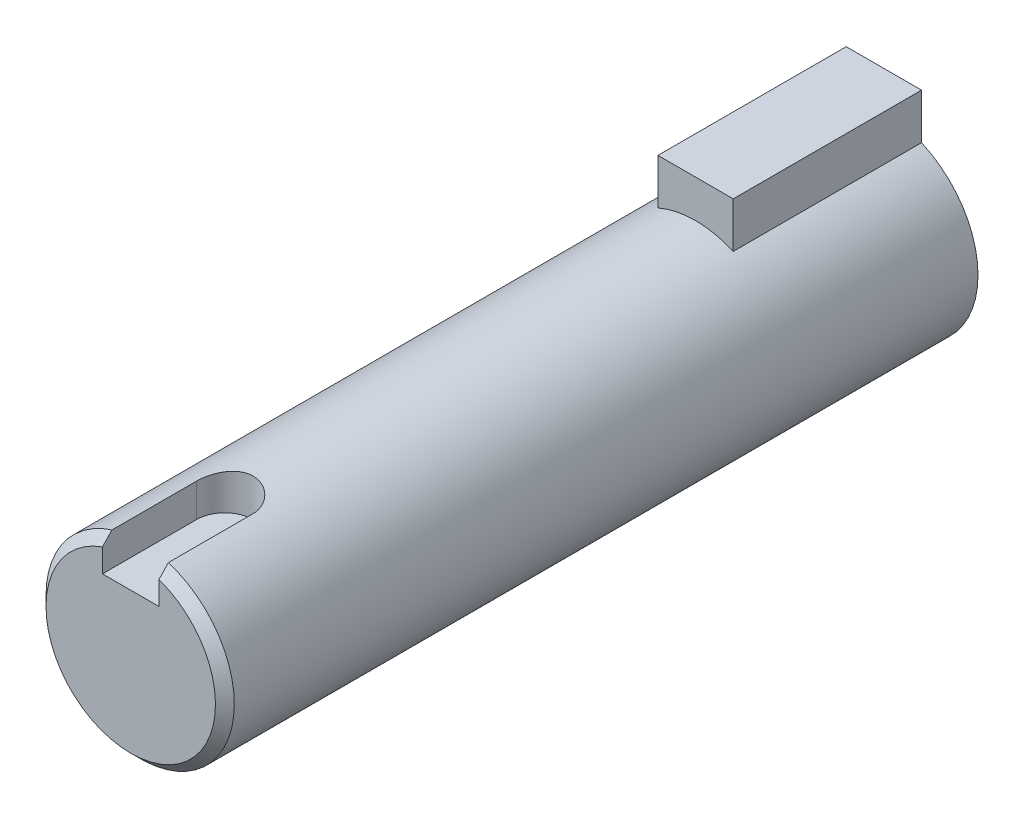
ISO-10303-21;
HEADER;
FILE_DESCRIPTION(('STEP AP214'),'2;1');
FILE_NAME('part.step','',(''),(''),'','','');
FILE_SCHEMA(('AUTOMOTIVE_DESIGN { 1 0 10303 214 1 1 1 1 }'));
ENDSEC;
DATA;
#1=APPLICATION_CONTEXT('core data for automotive mechanical design processes');
#2=APPLICATION_PROTOCOL_DEFINITION('international standard','automotive_design',2000,#1);
#3=PRODUCT_CONTEXT('',#1,'mechanical');
#4=PRODUCT('Part','Part','',(#3));
#5=PRODUCT_RELATED_PRODUCT_CATEGORY('part','',(#4));
#6=PRODUCT_DEFINITION_FORMATION('','',#4);
#7=PRODUCT_DEFINITION_CONTEXT('part definition',#1,'design');
#8=PRODUCT_DEFINITION('design','',#6,#7);
#9=PRODUCT_DEFINITION_SHAPE('','',#8);
#10=(LENGTH_UNIT() NAMED_UNIT(*) SI_UNIT(.MILLI.,.METRE.));
#11=(NAMED_UNIT(*) PLANE_ANGLE_UNIT() SI_UNIT($,.RADIAN.));
#12=(NAMED_UNIT(*) SI_UNIT($,.STERADIAN.) SOLID_ANGLE_UNIT());
#13=UNCERTAINTY_MEASURE_WITH_UNIT(LENGTH_MEASURE(1.E-05),#10,'distance_accuracy_value','');
#14=(GEOMETRIC_REPRESENTATION_CONTEXT(3) GLOBAL_UNCERTAINTY_ASSIGNED_CONTEXT((#13)) GLOBAL_UNIT_ASSIGNED_CONTEXT((#10,
#11,#12)) REPRESENTATION_CONTEXT('',''));
#15=CARTESIAN_POINT('',(0.,0.,0.));
#16=DIRECTION('',(0.,0.,1.));
#17=DIRECTION('',(1.,0.,0.));
#18=AXIS2_PLACEMENT_3D('',#15,#16,#17);
#19=CARTESIAN_POINT('',(0.,0.,10.));
#20=DIRECTION('',(0.,0.,-1.));
#21=DIRECTION('',(-1.,0.,0.));
#22=AXIS2_PLACEMENT_3D('',#19,#20,#21);
#23=CYLINDRICAL_SURFACE('',#22,5.);
#24=CARTESIAN_POINT('',(0.,0.,0.));
#25=DIRECTION('',(0.,0.,1.));
#26=DIRECTION('',(1.,0.,0.));
#27=AXIS2_PLACEMENT_3D('',#24,#25,#26);
#28=CIRCLE('',#27,5.);
#29=CARTESIAN_POINT('',(-2.,4.58257569495584,0.));
#30=VERTEX_POINT('',#29);
#31=CARTESIAN_POINT('',(2.,4.58257569495584,0.));
#32=VERTEX_POINT('',#31);
#33=EDGE_CURVE('E173',#30,#32,#28,.T.);
#34=ORIENTED_EDGE('',*,*,#33,.T.);
#35=DIRECTION('',(0.,0.,-1.));
#36=VECTOR('',#35,1.);
#37=CARTESIAN_POINT('',(2.,4.58257569495584,10.));
#38=LINE('',#37,#36);
#39=CARTESIAN_POINT('',(2.,4.58257569495584,10.));
#40=VERTEX_POINT('',#39);
#41=EDGE_CURVE('E150',#40,#32,#38,.T.);
#42=ORIENTED_EDGE('',*,*,#41,.F.);
#43=CARTESIAN_POINT('',(0.,0.,10.));
#44=DIRECTION('',(0.,0.,1.));
#45=DIRECTION('',(1.,0.,0.));
#46=AXIS2_PLACEMENT_3D('',#43,#44,#45);
#47=CIRCLE('',#46,5.);
#48=CARTESIAN_POINT('',(-2.,4.58257569495584,10.));
#49=VERTEX_POINT('',#48);
#50=EDGE_CURVE('E172',#40,#49,#47,.T.);
#51=ORIENTED_EDGE('',*,*,#50,.T.);
#52=DIRECTION('',(0.,0.,-1.));
#53=VECTOR('',#52,1.);
#54=CARTESIAN_POINT('',(-2.,4.58257569495584,10.));
#55=LINE('',#54,#53);
#56=EDGE_CURVE('E187',#49,#30,#55,.T.);
#57=ORIENTED_EDGE('',*,*,#56,.T.);
#58=EDGE_LOOP('',(#34,#42,#51,#57));
#59=FACE_BOUND('',#58,.T.);
#60=DIRECTION('',(0.,0.,-1.));
#61=VECTOR('',#60,1.);
#62=CARTESIAN_POINT('',(1.5,4.76969600708473,10.));
#63=LINE('',#62,#61);
#64=CARTESIAN_POINT('',(1.5,4.76969600708473,39.5));
#65=VERTEX_POINT('',#64);
#66=CARTESIAN_POINT('',(1.5,4.76969600708473,35.));
#67=VERTEX_POINT('',#66);
#68=EDGE_CURVE('E169',#65,#67,#63,.T.);
#69=ORIENTED_EDGE('',*,*,#68,.F.);
#70=CARTESIAN_POINT('',(0.,0.,39.5));
#71=DIRECTION('',(0.,0.,1.));
#72=DIRECTION('',(1.,0.,0.));
#73=AXIS2_PLACEMENT_3D('',#70,#71,#72);
#74=CIRCLE('',#73,5.);
#75=CARTESIAN_POINT('',(-1.5,4.76969600708473,39.5));
#76=VERTEX_POINT('',#75);
#77=EDGE_CURVE('E64',#65,#76,#74,.F.);
#78=ORIENTED_EDGE('',*,*,#77,.T.);
#79=DIRECTION('',(0.,0.,-1.));
#80=VECTOR('',#79,1.);
#81=CARTESIAN_POINT('',(-1.5,4.76969600708473,10.));
#82=LINE('',#81,#80);
#83=CARTESIAN_POINT('',(-1.5,4.76969600708473,35.));
#84=VERTEX_POINT('',#83);
#85=EDGE_CURVE('E164',#84,#76,#82,.F.);
#86=ORIENTED_EDGE('',*,*,#85,.F.);
#87=CARTESIAN_POINT('',(1.5,4.76969600708473,35.));
#88=CARTESIAN_POINT('',(1.50000085357071,4.76969249084934,34.958820607092));
#89=CARTESIAN_POINT('',(1.49830317083428,4.77022997000129,34.9176619568739));
#90=CARTESIAN_POINT('',(1.49153785660317,4.77235095109999,34.8356588379044));
#91=CARTESIAN_POINT('',(1.48647098275841,4.77393421787376,34.7948143006051));
#92=CARTESIAN_POINT('',(1.46630203689311,4.78018490618873,34.6734094590453));
#93=CARTESIAN_POINT('',(1.44623120413662,4.78635370384275,34.5936936095836));
#94=CARTESIAN_POINT('',(1.39353102315626,4.80195952113208,34.4389644216141));
#95=CARTESIAN_POINT('',(1.36090607068203,4.81139539670393,34.3639494478019));
#96=CARTESIAN_POINT('',(1.28407841117656,4.83246571212052,34.2204033184024));
#97=CARTESIAN_POINT('',(1.23987031651226,4.84410117434933,34.1518752002716));
#98=CARTESIAN_POINT('',(1.13964850658326,4.86866835244721,34.021133944003));
#99=CARTESIAN_POINT('',(1.08333433465208,4.88162755412974,33.9591563396566));
#100=CARTESIAN_POINT('',(0.961138919873353,4.90714811559049,33.8453644161));
#101=CARTESIAN_POINT('',(0.895256063916347,4.91970940785249,33.7935518139969));
#102=CARTESIAN_POINT('',(0.754109921315428,4.94333239727705,33.7005362296815));
#103=CARTESIAN_POINT('',(0.678680819336257,4.95435770971354,33.659574819702));
#104=CARTESIAN_POINT('',(0.521621185505773,4.97334469846208,33.5910115883818));
#105=CARTESIAN_POINT('',(0.439992259012927,4.98130716463903,33.5634063222057));
#106=CARTESIAN_POINT('',(0.275324697874878,4.99307639935002,33.523120200898));
#107=CARTESIAN_POINT('',(0.192393125294253,4.99699549276993,33.5100351420303));
#108=CARTESIAN_POINT('',(0.0254235719980806,5.00063202022426,33.4978826586367));
#109=CARTESIAN_POINT('',(-0.0586141962423639,5.00035024971471,33.4988125802998));
#110=CARTESIAN_POINT('',(-0.222571599946019,4.99569602566267,33.514392908759));
#111=CARTESIAN_POINT('',(-0.302537145464643,4.99145415509187,33.5286053449787));
#112=CARTESIAN_POINT('',(-0.458890052102027,4.9795151369998,33.5696316352381));
#113=CARTESIAN_POINT('',(-0.535277225531999,4.97181780846028,33.5964461494559));
#114=CARTESIAN_POINT('',(-0.683347815892217,4.95365214926145,33.6622122216464));
#115=CARTESIAN_POINT('',(-0.754966006044144,4.94315255692525,33.7013016443569));
#116=CARTESIAN_POINT('',(-0.890765529574422,4.92049624651755,33.7903985900483));
#117=CARTESIAN_POINT('',(-0.954945191614596,4.90833915735884,33.8404085594788));
#118=CARTESIAN_POINT('',(-1.07665450541275,4.88311673571409,33.9521919880835));
#119=CARTESIAN_POINT('',(-1.13383351478034,4.87003445449554,34.0143438637607));
#120=CARTESIAN_POINT('',(-1.23706769492487,4.84484215114658,34.1474974234279));
#121=CARTESIAN_POINT('',(-1.28311962013078,4.83273241337565,34.2185016803655));
#122=CARTESIAN_POINT('',(-1.36316407240863,4.81077228795653,34.3682809284493));
#123=CARTESIAN_POINT('',(-1.39703006341135,4.80094596245948,34.4471271795934));
#124=CARTESIAN_POINT('',(-1.45085886004699,4.78495663653201,34.6097245039817));
#125=CARTESIAN_POINT('',(-1.47084293218036,4.77878803475875,34.6934678607144));
#126=CARTESIAN_POINT('',(-1.4890120359008,4.77314032325006,34.8149948890702));
#127=CARTESIAN_POINT('',(-1.49313202989009,4.77185156275267,34.8518907341796));
#128=CARTESIAN_POINT('',(-1.49862355614854,4.77012928611782,34.9258514790995));
#129=CARTESIAN_POINT('',(-1.49999912968269,4.76969451246644,34.9629160496639));
#130=CARTESIAN_POINT('',(-1.5,4.76969600708473,35.));
#131=B_SPLINE_CURVE_WITH_KNOTS('',3,(#87,#88,#89,#90,#91,#92,#93,#94,#95,#96,#97,#98,#99,#100,
#101,#102,#103,#104,#105,#106,#107,#108,#109,#110,#111,#112,#113,#114,#115,#116,#117,#118,#119,
#120,#121,#122,#123,#124,#125,#126,#127,#128,#129,#130),.UNSPECIFIED.,.F.,.F.,(4,2,2,2,2,2,2,2,
2,2,2,2,2,2,2,2,2,2,2,2,2,4),(0.,0.123459071219744,0.246890388853047,0.492911349615212,
0.738846245884322,0.984895736828089,1.23795510798803,1.49105719006936,1.74939356197455,
2.00766326783256,2.25854751319802,2.50938425289471,2.75223130012967,2.99509107067836,
3.24078242562731,3.48652887757005,3.74172568310981,3.99699683536778,4.25484698071527,
4.51230123440207,4.62365084745809,4.73483637253615),.UNSPECIFIED.);
#132=EDGE_CURVE('E131',#67,#84,#131,.T.);
#133=ORIENTED_EDGE('',*,*,#132,.F.);
#134=EDGE_LOOP('',(#69,#78,#86,#133));
#135=FACE_BOUND('',#134,.T.);
#136=ADVANCED_FACE('F50',(#59,#135),#23,.T.);
#137=CARTESIAN_POINT('',(0.,0.,40.));
#138=DIRECTION('',(0.,0.,1.));
#139=DIRECTION('',(1.,0.,0.));
#140=AXIS2_PLACEMENT_3D('',#137,#138,#139);
#141=PLANE('',#140);
#142=DIRECTION('',(0.,1.,0.));
#143=VECTOR('',#142,1.);
#144=CARTESIAN_POINT('',(-1.5,0.,40.));
#145=LINE('',#144,#143);
#146=CARTESIAN_POINT('',(-1.5,3.,40.));
#147=VERTEX_POINT('',#146);
#148=CARTESIAN_POINT('',(-1.5,4.24264068711929,40.));
#149=VERTEX_POINT('',#148);
#150=EDGE_CURVE('E133',#147,#149,#145,.T.);
#151=ORIENTED_EDGE('',*,*,#150,.T.);
#152=CARTESIAN_POINT('',(0.,0.,40.));
#153=DIRECTION('',(0.,0.,1.));
#154=DIRECTION('',(1.,0.,0.));
#155=AXIS2_PLACEMENT_3D('',#152,#153,#154);
#156=CIRCLE('',#155,4.5);
#157=CARTESIAN_POINT('',(1.5,4.24264068711929,40.));
#158=VERTEX_POINT('',#157);
#159=EDGE_CURVE('E132',#149,#158,#156,.T.);
#160=ORIENTED_EDGE('',*,*,#159,.T.);
#161=DIRECTION('',(0.,-1.,0.));
#162=VECTOR('',#161,1.);
#163=CARTESIAN_POINT('',(1.5,0.,40.));
#164=LINE('',#163,#162);
#165=CARTESIAN_POINT('',(1.5,3.,40.));
#166=VERTEX_POINT('',#165);
#167=EDGE_CURVE('E124',#158,#166,#164,.T.);
#168=ORIENTED_EDGE('',*,*,#167,.T.);
#169=DIRECTION('',(-1.,0.,0.));
#170=VECTOR('',#169,1.);
#171=CARTESIAN_POINT('',(0.,3.,40.));
#172=LINE('',#171,#170);
#173=EDGE_CURVE('E129',#166,#147,#172,.T.);
#174=ORIENTED_EDGE('',*,*,#173,.T.);
#175=EDGE_LOOP('',(#151,#160,#168,#174));
#176=FACE_BOUND('',#175,.T.);
#177=ADVANCED_FACE('F126',(#176),#141,.T.);
#178=CARTESIAN_POINT('',(2.,7.,10.));
#179=DIRECTION('',(-1.,0.,0.));
#180=DIRECTION('',(0.,0.,1.));
#181=AXIS2_PLACEMENT_3D('',#178,#179,#180);
#182=PLANE('',#181);
#183=DIRECTION('',(0.,1.,0.));
#184=VECTOR('',#183,1.);
#185=CARTESIAN_POINT('',(2.,7.,0.));
#186=LINE('',#185,#184);
#187=CARTESIAN_POINT('',(2.,7.,0.));
#188=VERTEX_POINT('',#187);
#189=EDGE_CURVE('E188',#32,#188,#186,.T.);
#190=ORIENTED_EDGE('',*,*,#189,.T.);
#191=DIRECTION('',(0.,0.,-1.));
#192=VECTOR('',#191,1.);
#193=CARTESIAN_POINT('',(2.,7.,10.));
#194=LINE('',#193,#192);
#195=CARTESIAN_POINT('',(2.,7.,10.));
#196=VERTEX_POINT('',#195);
#197=EDGE_CURVE('E202',#196,#188,#194,.T.);
#198=ORIENTED_EDGE('',*,*,#197,.F.);
#199=DIRECTION('',(0.,1.,0.));
#200=VECTOR('',#199,1.);
#201=CARTESIAN_POINT('',(2.,7.,10.));
#202=LINE('',#201,#200);
#203=EDGE_CURVE('E176',#40,#196,#202,.T.);
#204=ORIENTED_EDGE('',*,*,#203,.F.);
#205=ORIENTED_EDGE('',*,*,#41,.T.);
#206=EDGE_LOOP('',(#190,#198,#204,#205));
#207=FACE_BOUND('',#206,.T.);
#208=ADVANCED_FACE('F243',(#207),#182,.F.);
#209=CARTESIAN_POINT('',(-2.,7.,10.));
#210=DIRECTION('',(0.,-1.,0.));
#211=DIRECTION('',(0.,0.,-1.));
#212=AXIS2_PLACEMENT_3D('',#209,#210,#211);
#213=PLANE('',#212);
#214=DIRECTION('',(-1.,0.,0.));
#215=VECTOR('',#214,1.);
#216=CARTESIAN_POINT('',(-2.,7.,0.));
#217=LINE('',#216,#215);
#218=CARTESIAN_POINT('',(-2.,7.,0.));
#219=VERTEX_POINT('',#218);
#220=EDGE_CURVE('E192',#188,#219,#217,.T.);
#221=ORIENTED_EDGE('',*,*,#220,.T.);
#222=DIRECTION('',(0.,0.,-1.));
#223=VECTOR('',#222,1.);
#224=CARTESIAN_POINT('',(-2.,7.,10.));
#225=LINE('',#224,#223);
#226=CARTESIAN_POINT('',(-2.,7.,10.));
#227=VERTEX_POINT('',#226);
#228=EDGE_CURVE('E203',#227,#219,#225,.T.);
#229=ORIENTED_EDGE('',*,*,#228,.F.);
#230=DIRECTION('',(-1.,0.,0.));
#231=VECTOR('',#230,1.);
#232=CARTESIAN_POINT('',(-2.,7.,10.));
#233=LINE('',#232,#231);
#234=EDGE_CURVE('E178',#196,#227,#233,.T.);
#235=ORIENTED_EDGE('',*,*,#234,.F.);
#236=ORIENTED_EDGE('',*,*,#197,.T.);
#237=EDGE_LOOP('',(#221,#229,#235,#236));
#238=FACE_BOUND('',#237,.T.);
#239=ADVANCED_FACE('F258',(#238),#213,.F.);
#240=CARTESIAN_POINT('',(-2.,7.,10.));
#241=DIRECTION('',(1.,0.,0.));
#242=DIRECTION('',(0.,0.,-1.));
#243=AXIS2_PLACEMENT_3D('',#240,#241,#242);
#244=PLANE('',#243);
#245=DIRECTION('',(0.,-1.,0.));
#246=VECTOR('',#245,1.);
#247=CARTESIAN_POINT('',(-2.,7.,0.));
#248=LINE('',#247,#246);
#249=EDGE_CURVE('E179',#219,#30,#248,.T.);
#250=ORIENTED_EDGE('',*,*,#249,.T.);
#251=ORIENTED_EDGE('',*,*,#56,.F.);
#252=DIRECTION('',(0.,-1.,0.));
#253=VECTOR('',#252,1.);
#254=CARTESIAN_POINT('',(-2.,7.,10.));
#255=LINE('',#254,#253);
#256=EDGE_CURVE('E181',#227,#49,#255,.T.);
#257=ORIENTED_EDGE('',*,*,#256,.F.);
#258=ORIENTED_EDGE('',*,*,#228,.T.);
#259=EDGE_LOOP('',(#250,#251,#257,#258));
#260=FACE_BOUND('',#259,.T.);
#261=ADVANCED_FACE('F248',(#260),#244,.F.);
#262=CARTESIAN_POINT('',(0.,0.,10.));
#263=DIRECTION('',(0.,0.,1.));
#264=DIRECTION('',(1.,0.,0.));
#265=AXIS2_PLACEMENT_3D('',#262,#263,#264);
#266=PLANE('',#265);
#267=ORIENTED_EDGE('',*,*,#50,.F.);
#268=ORIENTED_EDGE('',*,*,#203,.T.);
#269=ORIENTED_EDGE('',*,*,#234,.T.);
#270=ORIENTED_EDGE('',*,*,#256,.T.);
#271=EDGE_LOOP('',(#267,#268,#269,#270));
#272=FACE_BOUND('',#271,.T.);
#273=ADVANCED_FACE('F246',(#272),#266,.T.);
#274=CARTESIAN_POINT('',(0.,0.,0.));
#275=DIRECTION('',(0.,0.,1.));
#276=DIRECTION('',(1.,0.,0.));
#277=AXIS2_PLACEMENT_3D('',#274,#275,#276);
#278=PLANE('',#277);
#279=ORIENTED_EDGE('',*,*,#33,.F.);
#280=ORIENTED_EDGE('',*,*,#249,.F.);
#281=ORIENTED_EDGE('',*,*,#220,.F.);
#282=ORIENTED_EDGE('',*,*,#189,.F.);
#283=EDGE_LOOP('',(#279,#280,#281,#282));
#284=FACE_BOUND('',#283,.T.);
#285=ADVANCED_FACE('F229',(#284),#278,.F.);
#286=CARTESIAN_POINT('',(0.,7.,35.));
#287=DIRECTION('',(0.,-1.,0.));
#288=DIRECTION('',(0.,0.,-1.));
#289=AXIS2_PLACEMENT_3D('',#286,#287,#288);
#290=CYLINDRICAL_SURFACE('',#289,1.5);
#291=ORIENTED_EDGE('',*,*,#132,.T.);
#292=DIRECTION('',(0.,-1.,0.));
#293=VECTOR('',#292,1.);
#294=CARTESIAN_POINT('',(-1.5,7.,35.));
#295=LINE('',#294,#293);
#296=CARTESIAN_POINT('',(-1.5,3.,35.));
#297=VERTEX_POINT('',#296);
#298=EDGE_CURVE('E159',#84,#297,#295,.T.);
#299=ORIENTED_EDGE('',*,*,#298,.T.);
#300=CARTESIAN_POINT('',(0.,3.,35.));
#301=DIRECTION('',(0.,1.,0.));
#302=DIRECTION('',(0.,0.,1.));
#303=AXIS2_PLACEMENT_3D('',#300,#301,#302);
#304=CIRCLE('',#303,1.5);
#305=CARTESIAN_POINT('',(1.5,3.,35.));
#306=VERTEX_POINT('',#305);
#307=EDGE_CURVE('E153',#306,#297,#304,.T.);
#308=ORIENTED_EDGE('',*,*,#307,.F.);
#309=DIRECTION('',(0.,-1.,0.));
#310=VECTOR('',#309,1.);
#311=CARTESIAN_POINT('',(1.5,7.,35.));
#312=LINE('',#311,#310);
#313=EDGE_CURVE('E151',#67,#306,#312,.T.);
#314=ORIENTED_EDGE('',*,*,#313,.F.);
#315=EDGE_LOOP('',(#291,#299,#308,#314));
#316=FACE_BOUND('',#315,.T.);
#317=ADVANCED_FACE('F221',(#316),#290,.F.);
#318=CARTESIAN_POINT('',(1.5,7.,40.));
#319=DIRECTION('',(-1.,0.,0.));
#320=DIRECTION('',(0.,0.,1.));
#321=AXIS2_PLACEMENT_3D('',#318,#319,#320);
#322=PLANE('',#321);
#323=ORIENTED_EDGE('',*,*,#167,.F.);
#324=CARTESIAN_POINT('',(1.5,4.24264068711929,40.));
#325=CARTESIAN_POINT('',(1.5,4.33072666160121,39.9169232397423));
#326=CARTESIAN_POINT('',(1.5,4.41869093042371,39.8337181882542));
#327=CARTESIAN_POINT('',(1.5,4.59437603702419,39.6670515215299));
#328=CARTESIAN_POINT('',(1.5,4.68209687485685,39.5835899063514));
#329=CARTESIAN_POINT('',(1.5,4.76969600708473,39.5));
#330=B_SPLINE_CURVE_WITH_KNOTS('',3,(#324,#325,#326,#327,#328,#329),.UNSPECIFIED.,.F.,.F.,(4,2,
4),(0.,0.363245287159553,0.726490492749918),.UNSPECIFIED.);
#331=EDGE_CURVE('E80',#158,#65,#330,.T.);
#332=ORIENTED_EDGE('',*,*,#331,.T.);
#333=ORIENTED_EDGE('',*,*,#68,.T.);
#334=ORIENTED_EDGE('',*,*,#313,.T.);
#335=DIRECTION('',(0.,0.,-1.));
#336=VECTOR('',#335,1.);
#337=CARTESIAN_POINT('',(1.5,3.,40.));
#338=LINE('',#337,#336);
#339=EDGE_CURVE('E143',#166,#306,#338,.T.);
#340=ORIENTED_EDGE('',*,*,#339,.F.);
#341=EDGE_LOOP('',(#323,#332,#333,#334,#340));
#342=FACE_BOUND('',#341,.T.);
#343=ADVANCED_FACE('F149',(#342),#322,.T.);
#344=CARTESIAN_POINT('',(-1.5,7.,40.));
#345=DIRECTION('',(1.,0.,0.));
#346=DIRECTION('',(0.,0.,-1.));
#347=AXIS2_PLACEMENT_3D('',#344,#345,#346);
#348=PLANE('',#347);
#349=ORIENTED_EDGE('',*,*,#85,.T.);
#350=CARTESIAN_POINT('',(-1.5,4.76969600708473,39.5));
#351=CARTESIAN_POINT('',(-1.5,4.68209687485685,39.5835899063514));
#352=CARTESIAN_POINT('',(-1.5,4.59437603702419,39.6670515215299));
#353=CARTESIAN_POINT('',(-1.5,4.41869093042371,39.8337181882542));
#354=CARTESIAN_POINT('',(-1.5,4.33072666160121,39.9169232397423));
#355=CARTESIAN_POINT('',(-1.5,4.24264068711929,40.));
#356=B_SPLINE_CURVE_WITH_KNOTS('',3,(#350,#351,#352,#353,#354,#355),.UNSPECIFIED.,.F.,.F.,(4,2,
4),(0.,0.363245205590365,0.726490492749918),.UNSPECIFIED.);
#357=EDGE_CURVE('E11',#76,#149,#356,.T.);
#358=ORIENTED_EDGE('',*,*,#357,.T.);
#359=ORIENTED_EDGE('',*,*,#150,.F.);
#360=DIRECTION('',(0.,0.,1.));
#361=VECTOR('',#360,1.);
#362=CARTESIAN_POINT('',(-1.5,3.,40.));
#363=LINE('',#362,#361);
#364=EDGE_CURVE('E145',#297,#147,#363,.T.);
#365=ORIENTED_EDGE('',*,*,#364,.F.);
#366=ORIENTED_EDGE('',*,*,#298,.F.);
#367=EDGE_LOOP('',(#349,#358,#359,#365,#366));
#368=FACE_BOUND('',#367,.T.);
#369=ADVANCED_FACE('F228',(#368),#348,.T.);
#370=CARTESIAN_POINT('',(0.,3.,40.));
#371=DIRECTION('',(0.,1.,0.));
#372=DIRECTION('',(0.,0.,1.));
#373=AXIS2_PLACEMENT_3D('',#370,#371,#372);
#374=PLANE('',#373);
#375=ORIENTED_EDGE('',*,*,#339,.T.);
#376=ORIENTED_EDGE('',*,*,#307,.T.);
#377=ORIENTED_EDGE('',*,*,#364,.T.);
#378=ORIENTED_EDGE('',*,*,#173,.F.);
#379=EDGE_LOOP('',(#375,#376,#377,#378));
#380=FACE_BOUND('',#379,.T.);
#381=ADVANCED_FACE('F138',(#380),#374,.T.);
#382=CARTESIAN_POINT('',(0.,0.,40.));
#383=DIRECTION('',(0.,0.,-1.));
#384=DIRECTION('',(-1.,0.,0.));
#385=AXIS2_PLACEMENT_3D('',#382,#383,#384);
#386=CONICAL_SURFACE('',#385,4.5,0.785398163397459);
#387=ORIENTED_EDGE('',*,*,#357,.F.);
#388=ORIENTED_EDGE('',*,*,#77,.F.);
#389=ORIENTED_EDGE('',*,*,#331,.F.);
#390=ORIENTED_EDGE('',*,*,#159,.F.);
#391=EDGE_LOOP('',(#387,#388,#389,#390));
#392=FACE_BOUND('',#391,.T.);
#393=ADVANCED_FACE('F49',(#392),#386,.T.);
#394=CLOSED_SHELL('',(#136,#177,#208,#239,#261,#273,#285,#317,#343,#369,#381,#393));
#395=MANIFOLD_SOLID_BREP('B2',#394);
#396=ADVANCED_BREP_SHAPE_REPRESENTATION('',(#18,#395),#14);
#397=SHAPE_DEFINITION_REPRESENTATION(#9,#396);
ENDSEC;
END-ISO-10303-21;
